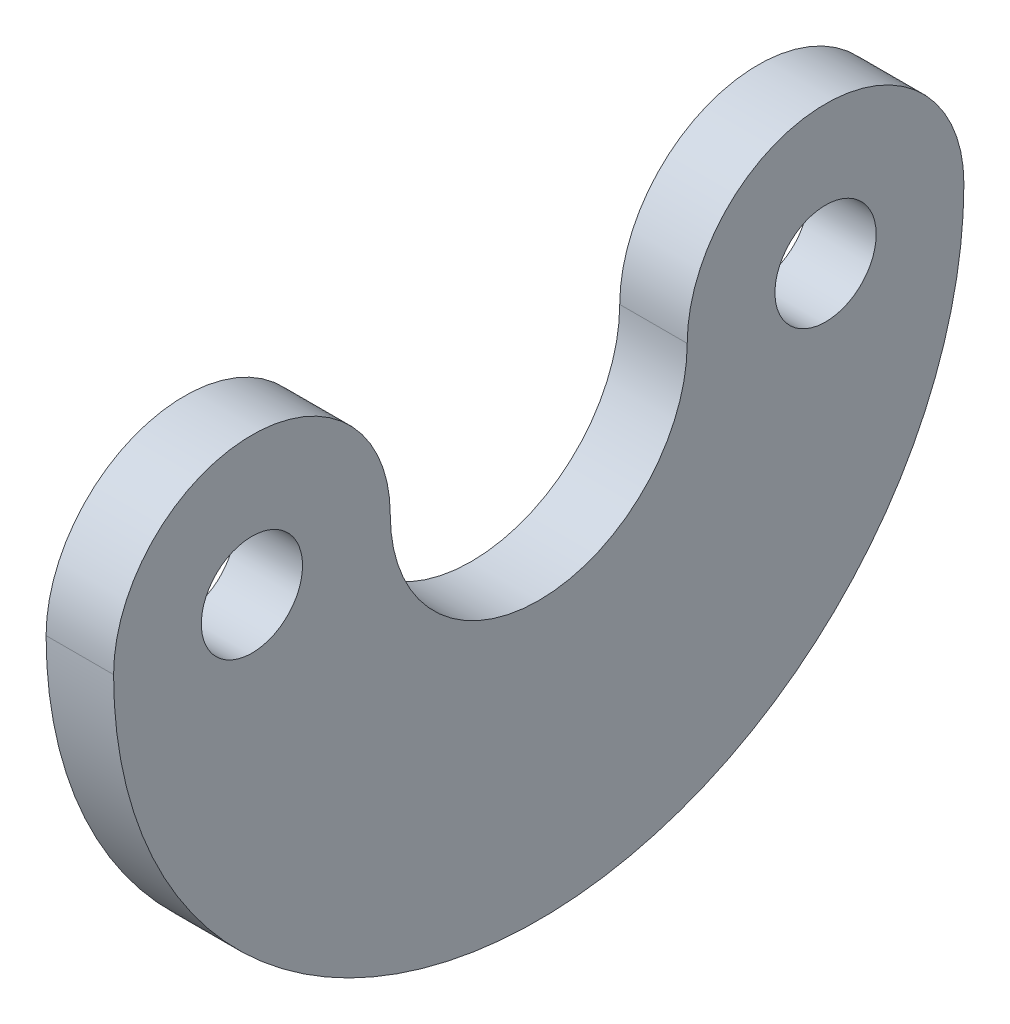
ISO-10303-21;
HEADER;
FILE_DESCRIPTION(('STEP AP214'),'2;1');
FILE_NAME('part.step','',(''),(''),'','','');
FILE_SCHEMA(('AUTOMOTIVE_DESIGN { 1 0 10303 214 1 1 1 1 }'));
ENDSEC;
DATA;
#1=APPLICATION_CONTEXT('core data for automotive mechanical design processes');
#2=APPLICATION_PROTOCOL_DEFINITION('international standard','automotive_design',2000,#1);
#3=PRODUCT_CONTEXT('',#1,'mechanical');
#4=PRODUCT('Part','Part','',(#3));
#5=PRODUCT_RELATED_PRODUCT_CATEGORY('part','',(#4));
#6=PRODUCT_DEFINITION_FORMATION('','',#4);
#7=PRODUCT_DEFINITION_CONTEXT('part definition',#1,'design');
#8=PRODUCT_DEFINITION('design','',#6,#7);
#9=PRODUCT_DEFINITION_SHAPE('','',#8);
#10=(LENGTH_UNIT() NAMED_UNIT(*) SI_UNIT(.MILLI.,.METRE.));
#11=(NAMED_UNIT(*) PLANE_ANGLE_UNIT() SI_UNIT($,.RADIAN.));
#12=(NAMED_UNIT(*) SI_UNIT($,.STERADIAN.) SOLID_ANGLE_UNIT());
#13=UNCERTAINTY_MEASURE_WITH_UNIT(LENGTH_MEASURE(1.E-05),#10,'distance_accuracy_value','');
#14=(GEOMETRIC_REPRESENTATION_CONTEXT(3) GLOBAL_UNCERTAINTY_ASSIGNED_CONTEXT((#13)) GLOBAL_UNIT_ASSIGNED_CONTEXT((#10,
#11,#12)) REPRESENTATION_CONTEXT('',''));
#15=CARTESIAN_POINT('',(0.,0.,0.));
#16=DIRECTION('',(0.,0.,1.));
#17=DIRECTION('',(1.,0.,0.));
#18=AXIS2_PLACEMENT_3D('',#15,#16,#17);
#19=CARTESIAN_POINT('',(2.,0.,4.25));
#20=DIRECTION('',(1.,0.,0.));
#21=DIRECTION('',(0.,0.,-1.));
#22=AXIS2_PLACEMENT_3D('',#19,#20,#21);
#23=PLANE('',#22);
#24=CARTESIAN_POINT('',(2.,0.,8.5));
#25=DIRECTION('',(1.,0.,0.));
#26=DIRECTION('',(0.,0.,-1.));
#27=AXIS2_PLACEMENT_3D('',#24,#25,#26);
#28=CIRCLE('',#27,1.5);
#29=CARTESIAN_POINT('',(2.,0.,7.));
#30=VERTEX_POINT('',#29);
#31=EDGE_CURVE('E102',#30,#30,#28,.T.);
#32=ORIENTED_EDGE('',*,*,#31,.F.);
#33=EDGE_LOOP('',(#32));
#34=FACE_BOUND('',#33,.T.);
#35=CARTESIAN_POINT('',(2.,0.,8.5));
#36=DIRECTION('',(1.,0.,0.));
#37=DIRECTION('',(0.,0.,-1.));
#38=AXIS2_PLACEMENT_3D('',#35,#36,#37);
#39=CIRCLE('',#38,4.1);
#40=CARTESIAN_POINT('',(2.,0.,4.4));
#41=VERTEX_POINT('',#40);
#42=CARTESIAN_POINT('',(2.,0.,12.6));
#43=VERTEX_POINT('',#42);
#44=EDGE_CURVE('E87',#41,#43,#39,.T.);
#45=ORIENTED_EDGE('',*,*,#44,.T.);
#46=CARTESIAN_POINT('',(2.,0.,0.));
#47=DIRECTION('',(1.,0.,0.));
#48=DIRECTION('',(0.,0.,-1.));
#49=AXIS2_PLACEMENT_3D('',#46,#47,#48);
#50=CIRCLE('',#49,12.6);
#51=CARTESIAN_POINT('',(2.,0.,-12.6));
#52=VERTEX_POINT('',#51);
#53=EDGE_CURVE('E82',#43,#52,#50,.T.);
#54=ORIENTED_EDGE('',*,*,#53,.T.);
#55=CARTESIAN_POINT('',(2.,0.,-8.5));
#56=DIRECTION('',(1.,0.,0.));
#57=DIRECTION('',(0.,0.,1.));
#58=AXIS2_PLACEMENT_3D('',#55,#56,#57);
#59=CIRCLE('',#58,4.1);
#60=CARTESIAN_POINT('',(2.,0.,-4.4));
#61=VERTEX_POINT('',#60);
#62=EDGE_CURVE('E85',#52,#61,#59,.T.);
#63=ORIENTED_EDGE('',*,*,#62,.T.);
#64=CARTESIAN_POINT('',(2.,0.,0.));
#65=DIRECTION('',(-1.,0.,0.));
#66=DIRECTION('',(0.,0.,-1.));
#67=AXIS2_PLACEMENT_3D('',#64,#65,#66);
#68=CIRCLE('',#67,4.4);
#69=EDGE_CURVE('E52',#61,#41,#68,.T.);
#70=ORIENTED_EDGE('',*,*,#69,.T.);
#71=EDGE_LOOP('',(#45,#54,#63,#70));
#72=FACE_BOUND('',#71,.T.);
#73=CARTESIAN_POINT('',(2.,0.,-8.5));
#74=DIRECTION('',(1.,0.,0.));
#75=DIRECTION('',(0.,0.,-1.));
#76=AXIS2_PLACEMENT_3D('',#73,#74,#75);
#77=CIRCLE('',#76,1.5);
#78=CARTESIAN_POINT('',(2.,0.,-10.));
#79=VERTEX_POINT('',#78);
#80=EDGE_CURVE('E117',#79,#79,#77,.T.);
#81=ORIENTED_EDGE('',*,*,#80,.F.);
#82=EDGE_LOOP('',(#81));
#83=FACE_BOUND('',#82,.T.);
#84=ADVANCED_FACE('F35',(#34,#72,#83),#23,.T.);
#85=CARTESIAN_POINT('',(0.,0.,4.25));
#86=DIRECTION('',(1.,0.,0.));
#87=DIRECTION('',(0.,0.,-1.));
#88=AXIS2_PLACEMENT_3D('',#85,#86,#87);
#89=PLANE('',#88);
#90=CARTESIAN_POINT('',(0.,0.,8.5));
#91=DIRECTION('',(1.,0.,0.));
#92=DIRECTION('',(0.,0.,-1.));
#93=AXIS2_PLACEMENT_3D('',#90,#91,#92);
#94=CIRCLE('',#93,1.5);
#95=CARTESIAN_POINT('',(0.,0.,7.));
#96=VERTEX_POINT('',#95);
#97=EDGE_CURVE('E114',#96,#96,#94,.T.);
#98=ORIENTED_EDGE('',*,*,#97,.T.);
#99=EDGE_LOOP('',(#98));
#100=FACE_BOUND('',#99,.T.);
#101=CARTESIAN_POINT('',(0.,0.,8.5));
#102=DIRECTION('',(1.,0.,0.));
#103=DIRECTION('',(0.,0.,-1.));
#104=AXIS2_PLACEMENT_3D('',#101,#102,#103);
#105=CIRCLE('',#104,4.1);
#106=CARTESIAN_POINT('',(0.,0.,4.4));
#107=VERTEX_POINT('',#106);
#108=CARTESIAN_POINT('',(0.,0.,12.6));
#109=VERTEX_POINT('',#108);
#110=EDGE_CURVE('E99',#107,#109,#105,.T.);
#111=ORIENTED_EDGE('',*,*,#110,.F.);
#112=CARTESIAN_POINT('',(0.,0.,0.));
#113=DIRECTION('',(-1.,0.,0.));
#114=DIRECTION('',(0.,0.,-1.));
#115=AXIS2_PLACEMENT_3D('',#112,#113,#114);
#116=CIRCLE('',#115,4.4);
#117=CARTESIAN_POINT('',(0.,0.,-4.4));
#118=VERTEX_POINT('',#117);
#119=EDGE_CURVE('E75',#118,#107,#116,.T.);
#120=ORIENTED_EDGE('',*,*,#119,.F.);
#121=CARTESIAN_POINT('',(0.,0.,-8.5));
#122=DIRECTION('',(1.,0.,0.));
#123=DIRECTION('',(0.,0.,1.));
#124=AXIS2_PLACEMENT_3D('',#121,#122,#123);
#125=CIRCLE('',#124,4.1);
#126=CARTESIAN_POINT('',(0.,0.,-12.6));
#127=VERTEX_POINT('',#126);
#128=EDGE_CURVE('E69',#127,#118,#125,.T.);
#129=ORIENTED_EDGE('',*,*,#128,.F.);
#130=CARTESIAN_POINT('',(0.,0.,0.));
#131=DIRECTION('',(1.,0.,0.));
#132=DIRECTION('',(0.,0.,-1.));
#133=AXIS2_PLACEMENT_3D('',#130,#131,#132);
#134=CIRCLE('',#133,12.6);
#135=EDGE_CURVE('E91',#109,#127,#134,.T.);
#136=ORIENTED_EDGE('',*,*,#135,.F.);
#137=EDGE_LOOP('',(#111,#120,#129,#136));
#138=FACE_BOUND('',#137,.T.);
#139=CARTESIAN_POINT('',(0.,0.,-8.5));
#140=DIRECTION('',(1.,0.,0.));
#141=DIRECTION('',(0.,0.,-1.));
#142=AXIS2_PLACEMENT_3D('',#139,#140,#141);
#143=CIRCLE('',#142,1.5);
#144=CARTESIAN_POINT('',(0.,0.,-10.));
#145=VERTEX_POINT('',#144);
#146=EDGE_CURVE('E120',#145,#145,#143,.T.);
#147=ORIENTED_EDGE('',*,*,#146,.T.);
#148=EDGE_LOOP('',(#147));
#149=FACE_BOUND('',#148,.T.);
#150=ADVANCED_FACE('F110',(#100,#138,#149),#89,.F.);
#151=CARTESIAN_POINT('',(2.,0.,8.5));
#152=DIRECTION('',(-1.,0.,0.));
#153=DIRECTION('',(0.,0.,1.));
#154=AXIS2_PLACEMENT_3D('',#151,#152,#153);
#155=CYLINDRICAL_SURFACE('',#154,4.1);
#156=ORIENTED_EDGE('',*,*,#110,.T.);
#157=DIRECTION('',(-1.,0.,0.));
#158=VECTOR('',#157,1.);
#159=CARTESIAN_POINT('',(2.,0.,12.6));
#160=LINE('',#159,#158);
#161=EDGE_CURVE('E11',#43,#109,#160,.T.);
#162=ORIENTED_EDGE('',*,*,#161,.F.);
#163=ORIENTED_EDGE('',*,*,#44,.F.);
#164=DIRECTION('',(-1.,0.,0.));
#165=VECTOR('',#164,1.);
#166=CARTESIAN_POINT('',(2.,0.,4.4));
#167=LINE('',#166,#165);
#168=EDGE_CURVE('E95',#41,#107,#167,.T.);
#169=ORIENTED_EDGE('',*,*,#168,.T.);
#170=EDGE_LOOP('',(#156,#162,#163,#169));
#171=FACE_BOUND('',#170,.T.);
#172=ADVANCED_FACE('F37',(#171),#155,.T.);
#173=CARTESIAN_POINT('',(2.,0.,0.));
#174=DIRECTION('',(-1.,0.,0.));
#175=DIRECTION('',(0.,0.,1.));
#176=AXIS2_PLACEMENT_3D('',#173,#174,#175);
#177=CYLINDRICAL_SURFACE('',#176,12.6);
#178=ORIENTED_EDGE('',*,*,#135,.T.);
#179=DIRECTION('',(-1.,0.,0.));
#180=VECTOR('',#179,1.);
#181=CARTESIAN_POINT('',(2.,0.,-12.6));
#182=LINE('',#181,#180);
#183=EDGE_CURVE('E44',#52,#127,#182,.T.);
#184=ORIENTED_EDGE('',*,*,#183,.F.);
#185=ORIENTED_EDGE('',*,*,#53,.F.);
#186=ORIENTED_EDGE('',*,*,#161,.T.);
#187=EDGE_LOOP('',(#178,#184,#185,#186));
#188=FACE_BOUND('',#187,.T.);
#189=ADVANCED_FACE('F90',(#188),#177,.T.);
#190=CARTESIAN_POINT('',(2.,0.,-8.5));
#191=DIRECTION('',(-1.,0.,0.));
#192=DIRECTION('',(0.,0.,1.));
#193=AXIS2_PLACEMENT_3D('',#190,#191,#192);
#194=CYLINDRICAL_SURFACE('',#193,4.1);
#195=ORIENTED_EDGE('',*,*,#128,.T.);
#196=DIRECTION('',(-1.,0.,0.));
#197=VECTOR('',#196,1.);
#198=CARTESIAN_POINT('',(2.,0.,-4.4));
#199=LINE('',#198,#197);
#200=EDGE_CURVE('E92',#61,#118,#199,.T.);
#201=ORIENTED_EDGE('',*,*,#200,.F.);
#202=ORIENTED_EDGE('',*,*,#62,.F.);
#203=ORIENTED_EDGE('',*,*,#183,.T.);
#204=EDGE_LOOP('',(#195,#201,#202,#203));
#205=FACE_BOUND('',#204,.T.);
#206=ADVANCED_FACE('F93',(#205),#194,.T.);
#207=CARTESIAN_POINT('',(2.,0.,0.));
#208=DIRECTION('',(-1.,0.,0.));
#209=DIRECTION('',(0.,0.,1.));
#210=AXIS2_PLACEMENT_3D('',#207,#208,#209);
#211=CYLINDRICAL_SURFACE('',#210,4.4);
#212=ORIENTED_EDGE('',*,*,#119,.T.);
#213=ORIENTED_EDGE('',*,*,#168,.F.);
#214=ORIENTED_EDGE('',*,*,#69,.F.);
#215=ORIENTED_EDGE('',*,*,#200,.T.);
#216=EDGE_LOOP('',(#212,#213,#214,#215));
#217=FACE_BOUND('',#216,.T.);
#218=ADVANCED_FACE('F107',(#217),#211,.F.);
#219=CARTESIAN_POINT('',(2.,0.,8.5));
#220=DIRECTION('',(-1.,0.,0.));
#221=DIRECTION('',(0.,0.,1.));
#222=AXIS2_PLACEMENT_3D('',#219,#220,#221);
#223=CYLINDRICAL_SURFACE('',#222,1.5);
#224=ORIENTED_EDGE('',*,*,#31,.T.);
#225=EDGE_LOOP('',(#224));
#226=FACE_BOUND('',#225,.T.);
#227=ORIENTED_EDGE('',*,*,#97,.F.);
#228=EDGE_LOOP('',(#227));
#229=FACE_BOUND('',#228,.T.);
#230=ADVANCED_FACE('F138',(#226,#229),#223,.F.);
#231=CARTESIAN_POINT('',(2.,0.,-8.5));
#232=DIRECTION('',(-1.,0.,0.));
#233=DIRECTION('',(0.,0.,1.));
#234=AXIS2_PLACEMENT_3D('',#231,#232,#233);
#235=CYLINDRICAL_SURFACE('',#234,1.5);
#236=ORIENTED_EDGE('',*,*,#80,.T.);
#237=EDGE_LOOP('',(#236));
#238=FACE_BOUND('',#237,.T.);
#239=ORIENTED_EDGE('',*,*,#146,.F.);
#240=EDGE_LOOP('',(#239));
#241=FACE_BOUND('',#240,.T.);
#242=ADVANCED_FACE('F126',(#238,#241),#235,.F.);
#243=CLOSED_SHELL('',(#84,#150,#172,#189,#206,#218,#230,#242));
#244=MANIFOLD_SOLID_BREP('B2',#243);
#245=ADVANCED_BREP_SHAPE_REPRESENTATION('',(#18,#244),#14);
#246=SHAPE_DEFINITION_REPRESENTATION(#9,#245);
ENDSEC;
END-ISO-10303-21;
